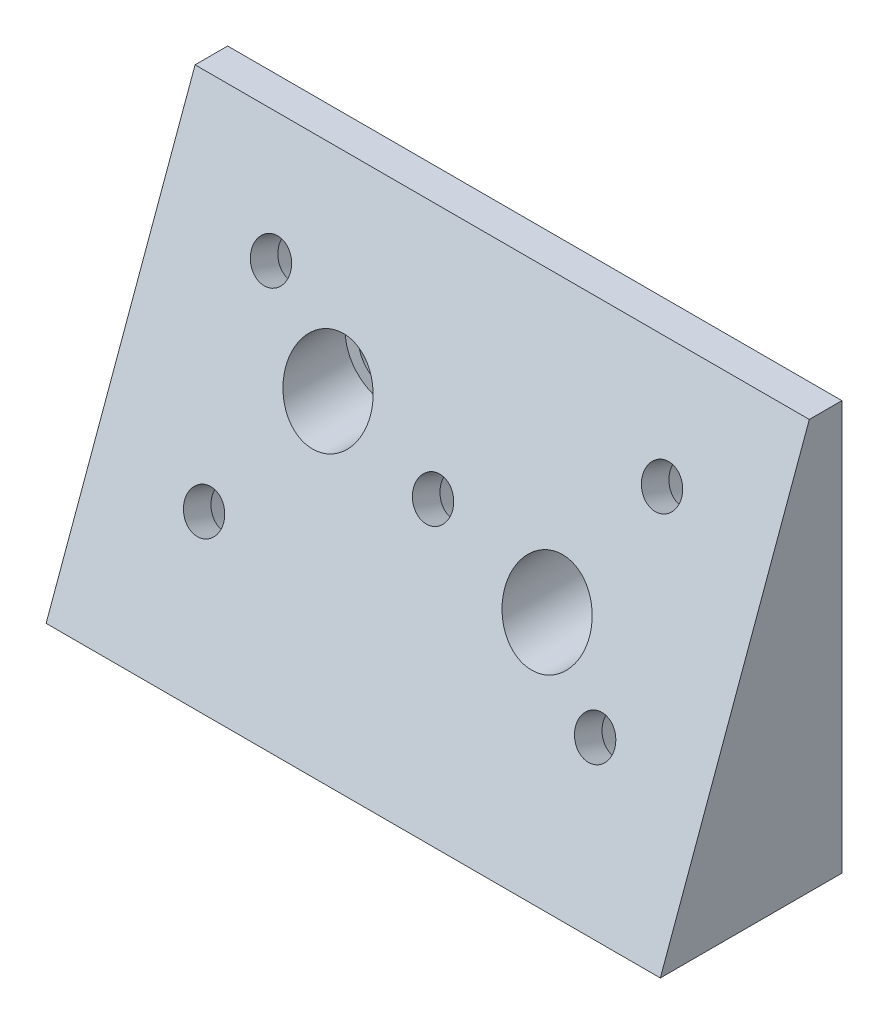
ISO-10303-21;
HEADER;
FILE_DESCRIPTION(('STEP AP214'),'2;1');
FILE_NAME('part.step','',(''),(''),'','','');
FILE_SCHEMA(('AUTOMOTIVE_DESIGN { 1 0 10303 214 1 1 1 1 }'));
ENDSEC;
DATA;
#1=APPLICATION_CONTEXT('core data for automotive mechanical design processes');
#2=APPLICATION_PROTOCOL_DEFINITION('international standard','automotive_design',2000,#1);
#3=PRODUCT_CONTEXT('',#1,'mechanical');
#4=PRODUCT('Part','Part','',(#3));
#5=PRODUCT_RELATED_PRODUCT_CATEGORY('part','',(#4));
#6=PRODUCT_DEFINITION_FORMATION('','',#4);
#7=PRODUCT_DEFINITION_CONTEXT('part definition',#1,'design');
#8=PRODUCT_DEFINITION('design','',#6,#7);
#9=PRODUCT_DEFINITION_SHAPE('','',#8);
#10=(LENGTH_UNIT() NAMED_UNIT(*) SI_UNIT(.MILLI.,.METRE.));
#11=(NAMED_UNIT(*) PLANE_ANGLE_UNIT() SI_UNIT($,.RADIAN.));
#12=(NAMED_UNIT(*) SI_UNIT($,.STERADIAN.) SOLID_ANGLE_UNIT());
#13=UNCERTAINTY_MEASURE_WITH_UNIT(LENGTH_MEASURE(1.E-05),#10,'distance_accuracy_value','');
#14=(GEOMETRIC_REPRESENTATION_CONTEXT(3) GLOBAL_UNCERTAINTY_ASSIGNED_CONTEXT((#13)) GLOBAL_UNIT_ASSIGNED_CONTEXT((#10,
#11,#12)) REPRESENTATION_CONTEXT('',''));
#15=CARTESIAN_POINT('',(0.,0.,0.));
#16=DIRECTION('',(0.,0.,1.));
#17=DIRECTION('',(1.,0.,0.));
#18=AXIS2_PLACEMENT_3D('',#15,#16,#17);
#19=CARTESIAN_POINT('',(-94.24,0.,0.));
#20=DIRECTION('',(0.,-1.,0.));
#21=DIRECTION('',(0.,0.,-1.));
#22=AXIS2_PLACEMENT_3D('',#19,#20,#21);
#23=PLANE('',#22);
#24=DIRECTION('',(0.,0.,-1.));
#25=VECTOR('',#24,1.);
#26=CARTESIAN_POINT('',(0.,0.,0.));
#27=LINE('',#26,#25);
#28=CARTESIAN_POINT('',(0.,0.,27.85359797));
#29=VERTEX_POINT('',#28);
#30=CARTESIAN_POINT('',(0.,0.,0.));
#31=VERTEX_POINT('',#30);
#32=EDGE_CURVE('E104',#29,#31,#27,.T.);
#33=ORIENTED_EDGE('',*,*,#32,.F.);
#34=DIRECTION('',(1.,0.,0.));
#35=VECTOR('',#34,1.);
#36=CARTESIAN_POINT('',(-94.24,0.,27.85359797));
#37=LINE('',#36,#35);
#38=CARTESIAN_POINT('',(-94.24,0.,27.85359797));
#39=VERTEX_POINT('',#38);
#40=EDGE_CURVE('E11',#39,#29,#37,.T.);
#41=ORIENTED_EDGE('',*,*,#40,.F.);
#42=DIRECTION('',(0.,0.,-1.));
#43=VECTOR('',#42,1.);
#44=CARTESIAN_POINT('',(-94.24,0.,0.));
#45=LINE('',#44,#43);
#46=CARTESIAN_POINT('',(-94.24,0.,0.));
#47=VERTEX_POINT('',#46);
#48=EDGE_CURVE('E97',#39,#47,#45,.T.);
#49=ORIENTED_EDGE('',*,*,#48,.T.);
#50=DIRECTION('',(1.,0.,0.));
#51=VECTOR('',#50,1.);
#52=CARTESIAN_POINT('',(-94.24,0.,0.));
#53=LINE('',#52,#51);
#54=EDGE_CURVE('E80',#47,#31,#53,.T.);
#55=ORIENTED_EDGE('',*,*,#54,.T.);
#56=EDGE_LOOP('',(#33,#41,#49,#55));
#57=FACE_BOUND('',#56,.T.);
#58=ADVANCED_FACE('F37',(#57),#23,.T.);
#59=CARTESIAN_POINT('',(-94.24,0.,27.85359797));
#60=DIRECTION('',(0.,0.342020143401997,0.939692620758127));
#61=DIRECTION('',(0.,-0.939692620758127,0.342020143401997));
#62=AXIS2_PLACEMENT_3D('',#59,#60,#61);
#63=PLANE('',#62);
#64=CARTESIAN_POINT('',(-17.20092637,47.9657014727267,10.3955103638167));
#65=DIRECTION('',(0.,0.342020143401997,0.939692620758127));
#66=DIRECTION('',(0.,-0.939692620758127,0.342020143401997));
#67=AXIS2_PLACEMENT_3D('',#64,#65,#66);
#68=CIRCLE('',#67,3.);
#69=CARTESIAN_POINT('',(-17.20092637,45.1466236104524,11.4215707940227));
#70=VERTEX_POINT('',#69);
#71=EDGE_CURVE('E162',#70,#70,#68,.T.);
#72=ORIENTED_EDGE('',*,*,#71,.F.);
#73=EDGE_LOOP('',(#72));
#74=FACE_BOUND('',#73,.T.);
#75=CARTESIAN_POINT('',(-17.20092637,19.7749228499829,20.6561146658766));
#76=DIRECTION('',(0.,0.342020143401997,0.939692620758127));
#77=DIRECTION('',(0.,-0.939692620758127,0.342020143401997));
#78=AXIS2_PLACEMENT_3D('',#75,#76,#77);
#79=CIRCLE('',#78,3.);
#80=CARTESIAN_POINT('',(-17.20092637,16.9558449877085,21.6821750960826));
#81=VERTEX_POINT('',#80);
#82=EDGE_CURVE('E158',#81,#81,#79,.T.);
#83=ORIENTED_EDGE('',*,*,#82,.F.);
#84=EDGE_LOOP('',(#83));
#85=FACE_BOUND('',#84,.T.);
#86=CARTESIAN_POINT('',(-77.20092637,47.9657014727267,10.3955103638167));
#87=DIRECTION('',(0.,0.342020143401997,0.939692620758127));
#88=DIRECTION('',(0.,-0.939692620758127,0.342020143401997));
#89=AXIS2_PLACEMENT_3D('',#86,#87,#88);
#90=CIRCLE('',#89,3.00000000000001);
#91=CARTESIAN_POINT('',(-77.20092637,45.1466236104523,11.4215707940227));
#92=VERTEX_POINT('',#91);
#93=EDGE_CURVE('E170',#92,#92,#90,.T.);
#94=ORIENTED_EDGE('',*,*,#93,.F.);
#95=EDGE_LOOP('',(#94));
#96=FACE_BOUND('',#95,.T.);
#97=CARTESIAN_POINT('',(-77.20092637,19.7749228499829,20.6561146658766));
#98=DIRECTION('',(0.,0.342020143401997,0.939692620758127));
#99=DIRECTION('',(0.,-0.939692620758127,0.342020143401997));
#100=AXIS2_PLACEMENT_3D('',#97,#98,#99);
#101=CIRCLE('',#100,3.00000000000001);
#102=CARTESIAN_POINT('',(-77.20092637,16.9558449877085,21.6821750960826));
#103=VERTEX_POINT('',#102);
#104=EDGE_CURVE('E167',#103,#103,#101,.T.);
#105=ORIENTED_EDGE('',*,*,#104,.F.);
#106=EDGE_LOOP('',(#105));
#107=FACE_BOUND('',#106,.T.);
#108=CARTESIAN_POINT('',(-47.20092637,33.8703121613548,15.5258125148467));
#109=DIRECTION('',(0.,0.342020143401997,0.939692620758127));
#110=DIRECTION('',(0.,-0.939692620758127,0.342020143401997));
#111=AXIS2_PLACEMENT_3D('',#108,#109,#110);
#112=CIRCLE('',#111,3.);
#113=CARTESIAN_POINT('',(-47.20092637,31.0512342990804,16.5518729450526));
#114=VERTEX_POINT('',#113);
#115=EDGE_CURVE('E173',#114,#114,#112,.T.);
#116=ORIENTED_EDGE('',*,*,#115,.F.);
#117=EDGE_LOOP('',(#116));
#118=FACE_BOUND('',#117,.T.);
#119=CARTESIAN_POINT('',(-28.02184799,29.25081122,17.2071733550894));
#120=DIRECTION('',(0.,0.342020143401997,0.939692620758127));
#121=DIRECTION('',(0.,0.939692620758127,-0.342020143401997));
#122=AXIS2_PLACEMENT_3D('',#119,#120,#121);
#123=ELLIPSE('',#122,6.91715552129793,6.5);
#124=CARTESIAN_POINT('',(-28.02184799,35.75081122,14.8413668317612));
#125=VERTEX_POINT('',#124);
#126=EDGE_CURVE('E125',#125,#125,#123,.T.);
#127=ORIENTED_EDGE('',*,*,#126,.F.);
#128=EDGE_LOOP('',(#127));
#129=FACE_BOUND('',#128,.T.);
#130=CARTESIAN_POINT('',(-64.99011516,38.46803544,13.8523780956041));
#131=DIRECTION('',(0.,0.342020143401997,0.939692620758127));
#132=DIRECTION('',(0.,0.939692620758127,-0.342020143401997));
#133=AXIS2_PLACEMENT_3D('',#130,#131,#132);
#134=ELLIPSE('',#133,6.91715552129793,6.5);
#135=CARTESIAN_POINT('',(-64.99011516,44.96803544,11.4865715722758));
#136=VERTEX_POINT('',#135);
#137=EDGE_CURVE('E122',#136,#136,#134,.T.);
#138=ORIENTED_EDGE('',*,*,#137,.F.);
#139=EDGE_LOOP('',(#138));
#140=FACE_BOUND('',#139,.T.);
#141=DIRECTION('',(0.,-0.939692620758127,0.342020143401997));
#142=VECTOR('',#141,1.);
#143=CARTESIAN_POINT('',(0.,0.,27.85359797));
#144=LINE('',#143,#142);
#145=CARTESIAN_POINT('',(0.,62.78974436,5.));
#146=VERTEX_POINT('',#145);
#147=EDGE_CURVE('E99',#146,#29,#144,.T.);
#148=ORIENTED_EDGE('',*,*,#147,.F.);
#149=DIRECTION('',(1.,0.,0.));
#150=VECTOR('',#149,1.);
#151=CARTESIAN_POINT('',(-94.24,62.78974436,5.));
#152=LINE('',#151,#150);
#153=CARTESIAN_POINT('',(-94.24,62.78974436,5.));
#154=VERTEX_POINT('',#153);
#155=EDGE_CURVE('E46',#154,#146,#152,.T.);
#156=ORIENTED_EDGE('',*,*,#155,.F.);
#157=DIRECTION('',(0.,-0.939692620758127,0.342020143401997));
#158=VECTOR('',#157,1.);
#159=CARTESIAN_POINT('',(-94.24,0.,27.85359797));
#160=LINE('',#159,#158);
#161=EDGE_CURVE('E94',#154,#39,#160,.T.);
#162=ORIENTED_EDGE('',*,*,#161,.T.);
#163=ORIENTED_EDGE('',*,*,#40,.T.);
#164=EDGE_LOOP('',(#148,#156,#162,#163));
#165=FACE_BOUND('',#164,.T.);
#166=ADVANCED_FACE('F195',(#74,#85,#96,#107,#118,#129,#140,#165),#63,.T.);
#167=CARTESIAN_POINT('',(-94.24,62.78974436,0.));
#168=DIRECTION('',(0.,1.,0.));
#169=DIRECTION('',(0.,0.,1.));
#170=AXIS2_PLACEMENT_3D('',#167,#168,#169);
#171=PLANE('',#170);
#172=DIRECTION('',(0.,0.,1.));
#173=VECTOR('',#172,1.);
#174=CARTESIAN_POINT('',(0.,62.78974436,0.));
#175=LINE('',#174,#173);
#176=CARTESIAN_POINT('',(0.,62.78974436,0.));
#177=VERTEX_POINT('',#176);
#178=EDGE_CURVE('E88',#177,#146,#175,.T.);
#179=ORIENTED_EDGE('',*,*,#178,.F.);
#180=DIRECTION('',(1.,0.,0.));
#181=VECTOR('',#180,1.);
#182=CARTESIAN_POINT('',(-94.24,62.78974436,0.));
#183=LINE('',#182,#181);
#184=CARTESIAN_POINT('',(-94.24,62.78974436,0.));
#185=VERTEX_POINT('',#184);
#186=EDGE_CURVE('E83',#185,#177,#183,.T.);
#187=ORIENTED_EDGE('',*,*,#186,.F.);
#188=DIRECTION('',(0.,0.,1.));
#189=VECTOR('',#188,1.);
#190=CARTESIAN_POINT('',(-94.24,62.78974436,0.));
#191=LINE('',#190,#189);
#192=EDGE_CURVE('E86',#185,#154,#191,.T.);
#193=ORIENTED_EDGE('',*,*,#192,.T.);
#194=ORIENTED_EDGE('',*,*,#155,.T.);
#195=EDGE_LOOP('',(#179,#187,#193,#194));
#196=FACE_BOUND('',#195,.T.);
#197=ADVANCED_FACE('F85',(#196),#171,.T.);
#198=CARTESIAN_POINT('',(-94.24,0.,0.));
#199=DIRECTION('',(0.,0.,-1.));
#200=DIRECTION('',(-1.,0.,0.));
#201=AXIS2_PLACEMENT_3D('',#198,#199,#200);
#202=PLANE('',#201);
#203=CARTESIAN_POINT('',(-17.20092637,12.2567119541142,0.));
#204=DIRECTION('',(0.,0.,-1.));
#205=DIRECTION('',(0.,1.,0.));
#206=AXIS2_PLACEMENT_3D('',#203,#204,#205);
#207=ELLIPSE('',#206,5.05484441941003,4.75);
#208=CARTESIAN_POINT('',(-17.20092637,17.3115563735242,0.));
#209=VERTEX_POINT('',#208);
#210=EDGE_CURVE('E40',#209,#209,#207,.T.);
#211=ORIENTED_EDGE('',*,*,#210,.F.);
#212=EDGE_LOOP('',(#211));
#213=FACE_BOUND('',#212,.T.);
#214=CARTESIAN_POINT('',(-17.20092637,44.1820451293354,0.));
#215=DIRECTION('',(0.,0.,-1.));
#216=DIRECTION('',(0.,1.,0.));
#217=AXIS2_PLACEMENT_3D('',#214,#215,#216);
#218=ELLIPSE('',#217,5.05484441941003,4.75);
#219=CARTESIAN_POINT('',(-17.20092637,49.2368895487454,0.));
#220=VERTEX_POINT('',#219);
#221=EDGE_CURVE('E153',#220,#220,#218,.T.);
#222=ORIENTED_EDGE('',*,*,#221,.F.);
#223=EDGE_LOOP('',(#222));
#224=FACE_BOUND('',#223,.T.);
#225=CARTESIAN_POINT('',(-47.20092637,28.2193785417248,0.));
#226=DIRECTION('',(0.,0.,-1.));
#227=DIRECTION('',(0.,1.,0.));
#228=AXIS2_PLACEMENT_3D('',#225,#226,#227);
#229=ELLIPSE('',#228,5.05484441941002,4.75);
#230=CARTESIAN_POINT('',(-47.20092637,33.2742229611348,0.));
#231=VERTEX_POINT('',#230);
#232=EDGE_CURVE('E151',#231,#231,#229,.T.);
#233=ORIENTED_EDGE('',*,*,#232,.F.);
#234=EDGE_LOOP('',(#233));
#235=FACE_BOUND('',#234,.T.);
#236=CARTESIAN_POINT('',(-77.20092637,44.1820451293354,0.));
#237=DIRECTION('',(0.,0.,-1.));
#238=DIRECTION('',(0.,1.,0.));
#239=AXIS2_PLACEMENT_3D('',#236,#237,#238);
#240=ELLIPSE('',#239,5.05484441941003,4.75);
#241=CARTESIAN_POINT('',(-77.20092637,49.2368895487454,0.));
#242=VERTEX_POINT('',#241);
#243=EDGE_CURVE('E148',#242,#242,#240,.T.);
#244=ORIENTED_EDGE('',*,*,#243,.F.);
#245=EDGE_LOOP('',(#244));
#246=FACE_BOUND('',#245,.T.);
#247=CARTESIAN_POINT('',(-77.20092637,12.2567119541142,0.));
#248=DIRECTION('',(0.,0.,-1.));
#249=DIRECTION('',(0.,1.,0.));
#250=AXIS2_PLACEMENT_3D('',#247,#248,#249);
#251=ELLIPSE('',#250,5.05484441941003,4.75);
#252=CARTESIAN_POINT('',(-77.20092637,17.3115563735242,0.));
#253=VERTEX_POINT('',#252);
#254=EDGE_CURVE('E145',#253,#253,#251,.T.);
#255=ORIENTED_EDGE('',*,*,#254,.F.);
#256=EDGE_LOOP('',(#255));
#257=FACE_BOUND('',#256,.T.);
#258=CARTESIAN_POINT('',(-28.02184799,29.25081122,0.));
#259=DIRECTION('',(0.,0.,-1.));
#260=DIRECTION('',(-1.,0.,0.));
#261=AXIS2_PLACEMENT_3D('',#258,#259,#260);
#262=CIRCLE('',#261,4.5);
#263=CARTESIAN_POINT('',(-32.52184799,29.25081122,0.));
#264=VERTEX_POINT('',#263);
#265=EDGE_CURVE('E108',#264,#264,#262,.T.);
#266=ORIENTED_EDGE('',*,*,#265,.F.);
#267=EDGE_LOOP('',(#266));
#268=FACE_BOUND('',#267,.T.);
#269=CARTESIAN_POINT('',(-64.99011516,38.46803544,0.));
#270=DIRECTION('',(0.,0.,-1.));
#271=DIRECTION('',(-1.,0.,0.));
#272=AXIS2_PLACEMENT_3D('',#269,#270,#271);
#273=CIRCLE('',#272,4.50000000000001);
#274=CARTESIAN_POINT('',(-69.49011516,38.46803544,0.));
#275=VERTEX_POINT('',#274);
#276=EDGE_CURVE('E128',#275,#275,#273,.T.);
#277=ORIENTED_EDGE('',*,*,#276,.F.);
#278=EDGE_LOOP('',(#277));
#279=FACE_BOUND('',#278,.T.);
#280=DIRECTION('',(0.,1.,0.));
#281=VECTOR('',#280,1.);
#282=CARTESIAN_POINT('',(0.,0.,0.));
#283=LINE('',#282,#281);
#284=EDGE_CURVE('E107',#31,#177,#283,.T.);
#285=ORIENTED_EDGE('',*,*,#284,.F.);
#286=ORIENTED_EDGE('',*,*,#54,.F.);
#287=DIRECTION('',(0.,1.,0.));
#288=VECTOR('',#287,1.);
#289=CARTESIAN_POINT('',(-94.24,0.,0.));
#290=LINE('',#289,#288);
#291=EDGE_CURVE('E93',#47,#185,#290,.T.);
#292=ORIENTED_EDGE('',*,*,#291,.T.);
#293=ORIENTED_EDGE('',*,*,#186,.T.);
#294=EDGE_LOOP('',(#285,#286,#292,#293));
#295=FACE_BOUND('',#294,.T.);
#296=ADVANCED_FACE('F96',(#213,#224,#235,#246,#257,#268,#279,#295),#202,.T.);
#297=CARTESIAN_POINT('',(-94.24,0.,0.));
#298=DIRECTION('',(-1.,0.,0.));
#299=DIRECTION('',(0.,0.,1.));
#300=AXIS2_PLACEMENT_3D('',#297,#298,#299);
#301=PLANE('',#300);
#302=ORIENTED_EDGE('',*,*,#48,.F.);
#303=ORIENTED_EDGE('',*,*,#161,.F.);
#304=ORIENTED_EDGE('',*,*,#192,.F.);
#305=ORIENTED_EDGE('',*,*,#291,.F.);
#306=EDGE_LOOP('',(#302,#303,#304,#305));
#307=FACE_BOUND('',#306,.T.);
#308=ADVANCED_FACE('F92',(#307),#301,.T.);
#309=CARTESIAN_POINT('',(0.,0.,0.));
#310=DIRECTION('',(-1.,0.,0.));
#311=DIRECTION('',(0.,0.,1.));
#312=AXIS2_PLACEMENT_3D('',#309,#310,#311);
#313=PLANE('',#312);
#314=ORIENTED_EDGE('',*,*,#32,.T.);
#315=ORIENTED_EDGE('',*,*,#284,.T.);
#316=ORIENTED_EDGE('',*,*,#178,.T.);
#317=ORIENTED_EDGE('',*,*,#147,.T.);
#318=EDGE_LOOP('',(#314,#315,#316,#317));
#319=FACE_BOUND('',#318,.T.);
#320=ADVANCED_FACE('F193',(#319),#313,.F.);
#321=CARTESIAN_POINT('',(-64.99011516,38.46803544,94.24));
#322=DIRECTION('',(0.,0.,-1.));
#323=DIRECTION('',(-1.,0.,0.));
#324=AXIS2_PLACEMENT_3D('',#321,#322,#323);
#325=CYLINDRICAL_SURFACE('',#324,4.50000000000001);
#326=CARTESIAN_POINT('',(-64.99011516,38.46803544,4.69));
#327=DIRECTION('',(0.,0.,-1.));
#328=DIRECTION('',(-1.,0.,0.));
#329=AXIS2_PLACEMENT_3D('',#326,#327,#328);
#330=CIRCLE('',#329,4.50000000000001);
#331=CARTESIAN_POINT('',(-69.49011516,38.46803544,4.69));
#332=VERTEX_POINT('',#331);
#333=EDGE_CURVE('E118',#332,#332,#330,.F.);
#334=ORIENTED_EDGE('',*,*,#333,.T.);
#335=EDGE_LOOP('',(#334));
#336=FACE_BOUND('',#335,.T.);
#337=ORIENTED_EDGE('',*,*,#276,.T.);
#338=EDGE_LOOP('',(#337));
#339=FACE_BOUND('',#338,.T.);
#340=ADVANCED_FACE('F185',(#336,#339),#325,.F.);
#341=CARTESIAN_POINT('',(-28.02184799,29.25081122,94.24));
#342=DIRECTION('',(0.,0.,-1.));
#343=DIRECTION('',(-1.,0.,0.));
#344=AXIS2_PLACEMENT_3D('',#341,#342,#343);
#345=CYLINDRICAL_SURFACE('',#344,4.5);
#346=CARTESIAN_POINT('',(-28.02184799,29.25081122,4.69));
#347=DIRECTION('',(0.,0.,-1.));
#348=DIRECTION('',(-1.,0.,0.));
#349=AXIS2_PLACEMENT_3D('',#346,#347,#348);
#350=CIRCLE('',#349,4.5);
#351=CARTESIAN_POINT('',(-32.52184799,29.25081122,4.69));
#352=VERTEX_POINT('',#351);
#353=EDGE_CURVE('E115',#352,#352,#350,.F.);
#354=ORIENTED_EDGE('',*,*,#353,.T.);
#355=EDGE_LOOP('',(#354));
#356=FACE_BOUND('',#355,.T.);
#357=ORIENTED_EDGE('',*,*,#265,.T.);
#358=EDGE_LOOP('',(#357));
#359=FACE_BOUND('',#358,.T.);
#360=ADVANCED_FACE('F210',(#356,#359),#345,.F.);
#361=CARTESIAN_POINT('',(-28.02184799,29.25081122,4.69));
#362=DIRECTION('',(0.,0.,-1.));
#363=DIRECTION('',(-1.,0.,0.));
#364=AXIS2_PLACEMENT_3D('',#361,#362,#363);
#365=PLANE('',#364);
#366=CARTESIAN_POINT('',(-28.02184799,29.25081122,4.69));
#367=DIRECTION('',(0.,0.,-1.));
#368=DIRECTION('',(-1.,0.,0.));
#369=AXIS2_PLACEMENT_3D('',#366,#367,#368);
#370=CIRCLE('',#369,6.5);
#371=CARTESIAN_POINT('',(-34.52184799,29.25081122,4.69));
#372=VERTEX_POINT('',#371);
#373=EDGE_CURVE('E119',#372,#372,#370,.T.);
#374=ORIENTED_EDGE('',*,*,#373,.F.);
#375=EDGE_LOOP('',(#374));
#376=FACE_BOUND('',#375,.T.);
#377=ORIENTED_EDGE('',*,*,#353,.F.);
#378=EDGE_LOOP('',(#377));
#379=FACE_BOUND('',#378,.T.);
#380=ADVANCED_FACE('F216',(#376,#379),#365,.F.);
#381=CARTESIAN_POINT('',(-28.02184799,29.25081122,98.93));
#382=DIRECTION('',(0.,0.,-1.));
#383=DIRECTION('',(-1.,0.,0.));
#384=AXIS2_PLACEMENT_3D('',#381,#382,#383);
#385=CYLINDRICAL_SURFACE('',#384,6.5);
#386=ORIENTED_EDGE('',*,*,#126,.T.);
#387=EDGE_LOOP('',(#386));
#388=FACE_BOUND('',#387,.T.);
#389=ORIENTED_EDGE('',*,*,#373,.T.);
#390=EDGE_LOOP('',(#389));
#391=FACE_BOUND('',#390,.T.);
#392=ADVANCED_FACE('F222',(#388,#391),#385,.F.);
#393=CARTESIAN_POINT('',(-64.99011516,38.46803544,4.69));
#394=DIRECTION('',(0.,0.,-1.));
#395=DIRECTION('',(-1.,0.,0.));
#396=AXIS2_PLACEMENT_3D('',#393,#394,#395);
#397=PLANE('',#396);
#398=CARTESIAN_POINT('',(-64.99011516,38.46803544,4.69));
#399=DIRECTION('',(0.,0.,-1.));
#400=DIRECTION('',(-1.,0.,0.));
#401=AXIS2_PLACEMENT_3D('',#398,#399,#400);
#402=CIRCLE('',#401,6.5);
#403=CARTESIAN_POINT('',(-71.49011516,38.46803544,4.69));
#404=VERTEX_POINT('',#403);
#405=EDGE_CURVE('E176',#404,#404,#402,.T.);
#406=ORIENTED_EDGE('',*,*,#405,.F.);
#407=EDGE_LOOP('',(#406));
#408=FACE_BOUND('',#407,.T.);
#409=ORIENTED_EDGE('',*,*,#333,.F.);
#410=EDGE_LOOP('',(#409));
#411=FACE_BOUND('',#410,.T.);
#412=ADVANCED_FACE('F218',(#408,#411),#397,.F.);
#413=CARTESIAN_POINT('',(-64.99011516,38.46803544,98.93));
#414=DIRECTION('',(0.,0.,-1.));
#415=DIRECTION('',(-1.,0.,0.));
#416=AXIS2_PLACEMENT_3D('',#413,#414,#415);
#417=CYLINDRICAL_SURFACE('',#416,6.5);
#418=ORIENTED_EDGE('',*,*,#137,.T.);
#419=EDGE_LOOP('',(#418));
#420=FACE_BOUND('',#419,.T.);
#421=ORIENTED_EDGE('',*,*,#405,.T.);
#422=EDGE_LOOP('',(#421));
#423=FACE_BOUND('',#422,.T.);
#424=ADVANCED_FACE('F221',(#420,#423),#417,.F.);
#425=CARTESIAN_POINT('',(-47.20092637,1.63833384715066,-73.0308200653993));
#426=DIRECTION('',(0.,0.342020143401997,0.939692620758127));
#427=DIRECTION('',(0.,-0.939692620758127,0.342020143401997));
#428=AXIS2_PLACEMENT_3D('',#425,#426,#427);
#429=CYLINDRICAL_SURFACE('',#428,3.);
#430=CARTESIAN_POINT('',(-47.20092637,32.3312215160459,11.2971957214351));
#431=DIRECTION('',(0.,0.342020143401997,0.939692620758127));
#432=DIRECTION('',(0.,-0.939692620758127,0.342020143401997));
#433=AXIS2_PLACEMENT_3D('',#430,#431,#432);
#434=CIRCLE('',#433,3.);
#435=CARTESIAN_POINT('',(-47.20092637,29.5121436537715,12.3232561516411));
#436=VERTEX_POINT('',#435);
#437=EDGE_CURVE('E142',#436,#436,#434,.F.);
#438=ORIENTED_EDGE('',*,*,#437,.T.);
#439=EDGE_LOOP('',(#438));
#440=FACE_BOUND('',#439,.T.);
#441=ORIENTED_EDGE('',*,*,#115,.T.);
#442=EDGE_LOOP('',(#441));
#443=FACE_BOUND('',#442,.T.);
#444=ADVANCED_FACE('F226',(#440,#443),#429,.F.);
#445=CARTESIAN_POINT('',(-77.20092637,-12.4570554642212,-67.9005179143693));
#446=DIRECTION('',(0.,0.342020143401997,0.939692620758127));
#447=DIRECTION('',(0.,-0.939692620758127,0.342020143401997));
#448=AXIS2_PLACEMENT_3D('',#445,#446,#447);
#449=CYLINDRICAL_SURFACE('',#448,3.00000000000001);
#450=CARTESIAN_POINT('',(-77.20092637,18.2358322046739,16.427497872465));
#451=DIRECTION('',(0.,0.342020143401997,0.939692620758127));
#452=DIRECTION('',(0.,-0.939692620758127,0.342020143401997));
#453=AXIS2_PLACEMENT_3D('',#450,#451,#452);
#454=CIRCLE('',#453,3.00000000000001);
#455=CARTESIAN_POINT('',(-77.20092637,15.4167543423996,17.453558302671));
#456=VERTEX_POINT('',#455);
#457=EDGE_CURVE('E139',#456,#456,#454,.F.);
#458=ORIENTED_EDGE('',*,*,#457,.T.);
#459=EDGE_LOOP('',(#458));
#460=FACE_BOUND('',#459,.T.);
#461=ORIENTED_EDGE('',*,*,#104,.T.);
#462=EDGE_LOOP('',(#461));
#463=FACE_BOUND('',#462,.T.);
#464=ADVANCED_FACE('F236',(#460,#463),#449,.F.);
#465=CARTESIAN_POINT('',(-77.20092637,15.7337231585226,-78.1611222164292));
#466=DIRECTION('',(0.,0.342020143401997,0.939692620758127));
#467=DIRECTION('',(0.,-0.939692620758127,0.342020143401997));
#468=AXIS2_PLACEMENT_3D('',#465,#466,#467);
#469=CYLINDRICAL_SURFACE('',#468,3.00000000000001);
#470=CARTESIAN_POINT('',(-77.20092637,46.4266108274178,6.16689357040513));
#471=DIRECTION('',(0.,0.342020143401997,0.939692620758127));
#472=DIRECTION('',(0.,-0.939692620758127,0.342020143401997));
#473=AXIS2_PLACEMENT_3D('',#470,#471,#472);
#474=CIRCLE('',#473,3.00000000000001);
#475=CARTESIAN_POINT('',(-77.20092637,43.6075329651434,7.19295400061113));
#476=VERTEX_POINT('',#475);
#477=EDGE_CURVE('E136',#476,#476,#474,.F.);
#478=ORIENTED_EDGE('',*,*,#477,.T.);
#479=EDGE_LOOP('',(#478));
#480=FACE_BOUND('',#479,.T.);
#481=ORIENTED_EDGE('',*,*,#93,.T.);
#482=EDGE_LOOP('',(#481));
#483=FACE_BOUND('',#482,.T.);
#484=ADVANCED_FACE('F246',(#480,#483),#469,.F.);
#485=CARTESIAN_POINT('',(-17.20092637,-12.4570554642212,-67.9005179143693));
#486=DIRECTION('',(0.,0.342020143401997,0.939692620758127));
#487=DIRECTION('',(0.,-0.939692620758127,0.342020143401997));
#488=AXIS2_PLACEMENT_3D('',#485,#486,#487);
#489=CYLINDRICAL_SURFACE('',#488,3.);
#490=CARTESIAN_POINT('',(-17.20092637,18.2358322046739,16.427497872465));
#491=DIRECTION('',(0.,0.342020143401997,0.939692620758127));
#492=DIRECTION('',(0.,-0.939692620758127,0.342020143401997));
#493=AXIS2_PLACEMENT_3D('',#490,#491,#492);
#494=CIRCLE('',#493,3.);
#495=CARTESIAN_POINT('',(-17.20092637,15.4167543423996,17.453558302671));
#496=VERTEX_POINT('',#495);
#497=EDGE_CURVE('E132',#496,#496,#494,.F.);
#498=ORIENTED_EDGE('',*,*,#497,.T.);
#499=EDGE_LOOP('',(#498));
#500=FACE_BOUND('',#499,.T.);
#501=ORIENTED_EDGE('',*,*,#82,.T.);
#502=EDGE_LOOP('',(#501));
#503=FACE_BOUND('',#502,.T.);
#504=ADVANCED_FACE('F242',(#500,#503),#489,.F.);
#505=CARTESIAN_POINT('',(-17.20092637,15.7337231585226,-78.1611222164292));
#506=DIRECTION('',(0.,0.342020143401997,0.939692620758127));
#507=DIRECTION('',(0.,-0.939692620758127,0.342020143401997));
#508=AXIS2_PLACEMENT_3D('',#505,#506,#507);
#509=CYLINDRICAL_SURFACE('',#508,3.);
#510=CARTESIAN_POINT('',(-17.20092637,46.4266108274178,6.16689357040513));
#511=DIRECTION('',(0.,0.342020143401997,0.939692620758127));
#512=DIRECTION('',(0.,-0.939692620758127,0.342020143401997));
#513=AXIS2_PLACEMENT_3D('',#510,#511,#512);
#514=CIRCLE('',#513,3.);
#515=CARTESIAN_POINT('',(-17.20092637,43.6075329651434,7.19295400061112));
#516=VERTEX_POINT('',#515);
#517=EDGE_CURVE('E129',#516,#516,#514,.F.);
#518=ORIENTED_EDGE('',*,*,#517,.T.);
#519=EDGE_LOOP('',(#518));
#520=FACE_BOUND('',#519,.T.);
#521=ORIENTED_EDGE('',*,*,#71,.T.);
#522=EDGE_LOOP('',(#521));
#523=FACE_BOUND('',#522,.T.);
#524=ADVANCED_FACE('F238',(#520,#523),#509,.F.);
#525=CARTESIAN_POINT('',(-17.20092637,46.4266108274178,6.16689357040513));
#526=DIRECTION('',(0.,0.342020143401997,0.939692620758127));
#527=DIRECTION('',(0.,-0.939692620758127,0.342020143401997));
#528=AXIS2_PLACEMENT_3D('',#525,#526,#527);
#529=PLANE('',#528);
#530=CARTESIAN_POINT('',(-17.20092637,46.4266108274178,6.16689357040513));
#531=DIRECTION('',(0.,0.342020143401997,0.939692620758127));
#532=DIRECTION('',(0.,-0.939692620758127,0.342020143401997));
#533=AXIS2_PLACEMENT_3D('',#530,#531,#532);
#534=CIRCLE('',#533,4.75);
#535=CARTESIAN_POINT('',(-17.20092637,41.9630708788166,7.79148925156462));
#536=VERTEX_POINT('',#535);
#537=EDGE_CURVE('E305',#536,#536,#534,.T.);
#538=ORIENTED_EDGE('',*,*,#537,.F.);
#539=EDGE_LOOP('',(#538));
#540=FACE_BOUND('',#539,.T.);
#541=ORIENTED_EDGE('',*,*,#517,.F.);
#542=EDGE_LOOP('',(#541));
#543=FACE_BOUND('',#542,.T.);
#544=ADVANCED_FACE('F241',(#540,#543),#529,.F.);
#545=CARTESIAN_POINT('',(-17.20092637,14.1946325132136,-82.3897390098408));
#546=DIRECTION('',(0.,0.342020143401997,0.939692620758127));
#547=DIRECTION('',(0.,-0.939692620758127,0.342020143401997));
#548=AXIS2_PLACEMENT_3D('',#545,#546,#547);
#549=CYLINDRICAL_SURFACE('',#548,4.75);
#550=ORIENTED_EDGE('',*,*,#221,.T.);
#551=EDGE_LOOP('',(#550));
#552=FACE_BOUND('',#551,.T.);
#553=ORIENTED_EDGE('',*,*,#537,.T.);
#554=EDGE_LOOP('',(#553));
#555=FACE_BOUND('',#554,.T.);
#556=ADVANCED_FACE('F268',(#552,#555),#549,.F.);
#557=CARTESIAN_POINT('',(-17.20092637,18.2358322046739,16.427497872465));
#558=DIRECTION('',(0.,0.342020143401997,0.939692620758127));
#559=DIRECTION('',(0.,-0.939692620758127,0.342020143401997));
#560=AXIS2_PLACEMENT_3D('',#557,#558,#559);
#561=PLANE('',#560);
#562=CARTESIAN_POINT('',(-17.20092637,18.2358322046739,16.427497872465));
#563=DIRECTION('',(0.,0.342020143401997,0.939692620758127));
#564=DIRECTION('',(0.,-0.939692620758127,0.342020143401997));
#565=AXIS2_PLACEMENT_3D('',#562,#563,#564);
#566=CIRCLE('',#565,4.75);
#567=CARTESIAN_POINT('',(-17.20092637,13.7722922560728,18.0520935536245));
#568=VERTEX_POINT('',#567);
#569=EDGE_CURVE('E302',#568,#568,#566,.T.);
#570=ORIENTED_EDGE('',*,*,#569,.F.);
#571=EDGE_LOOP('',(#570));
#572=FACE_BOUND('',#571,.T.);
#573=ORIENTED_EDGE('',*,*,#497,.F.);
#574=EDGE_LOOP('',(#573));
#575=FACE_BOUND('',#574,.T.);
#576=ADVANCED_FACE('F264',(#572,#575),#561,.F.);
#577=CARTESIAN_POINT('',(-17.20092637,-13.9961461095302,-72.1291347077809));
#578=DIRECTION('',(0.,0.342020143401997,0.939692620758127));
#579=DIRECTION('',(0.,-0.939692620758127,0.342020143401997));
#580=AXIS2_PLACEMENT_3D('',#577,#578,#579);
#581=CYLINDRICAL_SURFACE('',#580,4.75);
#582=ORIENTED_EDGE('',*,*,#210,.T.);
#583=EDGE_LOOP('',(#582));
#584=FACE_BOUND('',#583,.T.);
#585=ORIENTED_EDGE('',*,*,#569,.T.);
#586=EDGE_LOOP('',(#585));
#587=FACE_BOUND('',#586,.T.);
#588=ADVANCED_FACE('F267',(#584,#587),#581,.F.);
#589=CARTESIAN_POINT('',(-77.20092637,46.4266108274177,6.16689357040514));
#590=DIRECTION('',(0.,0.342020143401997,0.939692620758127));
#591=DIRECTION('',(0.,-0.939692620758127,0.342020143401997));
#592=AXIS2_PLACEMENT_3D('',#589,#590,#591);
#593=PLANE('',#592);
#594=CARTESIAN_POINT('',(-77.20092637,46.4266108274177,6.16689357040514));
#595=DIRECTION('',(0.,0.342020143401997,0.939692620758127));
#596=DIRECTION('',(0.,-0.939692620758127,0.342020143401997));
#597=AXIS2_PLACEMENT_3D('',#594,#595,#596);
#598=CIRCLE('',#597,4.75);
#599=CARTESIAN_POINT('',(-77.20092637,41.9630708788166,7.79148925156462));
#600=VERTEX_POINT('',#599);
#601=EDGE_CURVE('E296',#600,#600,#598,.T.);
#602=ORIENTED_EDGE('',*,*,#601,.F.);
#603=EDGE_LOOP('',(#602));
#604=FACE_BOUND('',#603,.T.);
#605=ORIENTED_EDGE('',*,*,#477,.F.);
#606=EDGE_LOOP('',(#605));
#607=FACE_BOUND('',#606,.T.);
#608=ADVANCED_FACE('F272',(#604,#607),#593,.F.);
#609=CARTESIAN_POINT('',(-77.20092637,14.1946325132136,-82.3897390098408));
#610=DIRECTION('',(0.,0.342020143401997,0.939692620758127));
#611=DIRECTION('',(0.,-0.939692620758127,0.342020143401997));
#612=AXIS2_PLACEMENT_3D('',#609,#610,#611);
#613=CYLINDRICAL_SURFACE('',#612,4.75);
#614=ORIENTED_EDGE('',*,*,#243,.T.);
#615=EDGE_LOOP('',(#614));
#616=FACE_BOUND('',#615,.T.);
#617=ORIENTED_EDGE('',*,*,#601,.T.);
#618=EDGE_LOOP('',(#617));
#619=FACE_BOUND('',#618,.T.);
#620=ADVANCED_FACE('F262',(#616,#619),#613,.F.);
#621=CARTESIAN_POINT('',(-77.20092637,18.2358322046739,16.427497872465));
#622=DIRECTION('',(0.,0.342020143401997,0.939692620758127));
#623=DIRECTION('',(0.,-0.939692620758127,0.342020143401997));
#624=AXIS2_PLACEMENT_3D('',#621,#622,#623);
#625=PLANE('',#624);
#626=CARTESIAN_POINT('',(-77.20092637,18.2358322046739,16.427497872465));
#627=DIRECTION('',(0.,0.342020143401997,0.939692620758127));
#628=DIRECTION('',(0.,-0.939692620758127,0.342020143401997));
#629=AXIS2_PLACEMENT_3D('',#626,#627,#628);
#630=CIRCLE('',#629,4.75);
#631=CARTESIAN_POINT('',(-77.20092637,13.7722922560728,18.0520935536245));
#632=VERTEX_POINT('',#631);
#633=EDGE_CURVE('E133',#632,#632,#630,.T.);
#634=ORIENTED_EDGE('',*,*,#633,.F.);
#635=EDGE_LOOP('',(#634));
#636=FACE_BOUND('',#635,.T.);
#637=ORIENTED_EDGE('',*,*,#457,.F.);
#638=EDGE_LOOP('',(#637));
#639=FACE_BOUND('',#638,.T.);
#640=ADVANCED_FACE('F258',(#636,#639),#625,.F.);
#641=CARTESIAN_POINT('',(-77.20092637,-13.9961461095302,-72.1291347077809));
#642=DIRECTION('',(0.,0.342020143401997,0.939692620758127));
#643=DIRECTION('',(0.,-0.939692620758127,0.342020143401997));
#644=AXIS2_PLACEMENT_3D('',#641,#642,#643);
#645=CYLINDRICAL_SURFACE('',#644,4.75);
#646=ORIENTED_EDGE('',*,*,#254,.T.);
#647=EDGE_LOOP('',(#646));
#648=FACE_BOUND('',#647,.T.);
#649=ORIENTED_EDGE('',*,*,#633,.T.);
#650=EDGE_LOOP('',(#649));
#651=FACE_BOUND('',#650,.T.);
#652=ADVANCED_FACE('F254',(#648,#651),#645,.F.);
#653=CARTESIAN_POINT('',(-47.20092637,32.3312215160458,11.2971957214351));
#654=DIRECTION('',(0.,0.342020143401997,0.939692620758127));
#655=DIRECTION('',(0.,-0.939692620758127,0.342020143401997));
#656=AXIS2_PLACEMENT_3D('',#653,#654,#655);
#657=PLANE('',#656);
#658=CARTESIAN_POINT('',(-47.20092637,32.3312215160458,11.2971957214351));
#659=DIRECTION('',(0.,0.342020143401997,0.939692620758127));
#660=DIRECTION('',(0.,-0.939692620758127,0.342020143401997));
#661=AXIS2_PLACEMENT_3D('',#658,#659,#660);
#662=CIRCLE('',#661,4.75);
#663=CARTESIAN_POINT('',(-47.20092637,27.8676815674447,12.9217914025946));
#664=VERTEX_POINT('',#663);
#665=EDGE_CURVE('E297',#664,#664,#662,.T.);
#666=ORIENTED_EDGE('',*,*,#665,.F.);
#667=EDGE_LOOP('',(#666));
#668=FACE_BOUND('',#667,.T.);
#669=ORIENTED_EDGE('',*,*,#437,.F.);
#670=EDGE_LOOP('',(#669));
#671=FACE_BOUND('',#670,.T.);
#672=ADVANCED_FACE('F257',(#668,#671),#657,.F.);
#673=CARTESIAN_POINT('',(-47.20092637,0.0992432018416742,-77.2594368588108));
#674=DIRECTION('',(0.,0.342020143401997,0.939692620758127));
#675=DIRECTION('',(0.,-0.939692620758127,0.342020143401997));
#676=AXIS2_PLACEMENT_3D('',#673,#674,#675);
#677=CYLINDRICAL_SURFACE('',#676,4.75);
#678=ORIENTED_EDGE('',*,*,#232,.T.);
#679=EDGE_LOOP('',(#678));
#680=FACE_BOUND('',#679,.T.);
#681=ORIENTED_EDGE('',*,*,#665,.T.);
#682=EDGE_LOOP('',(#681));
#683=FACE_BOUND('',#682,.T.);
#684=ADVANCED_FACE('F280',(#680,#683),#677,.F.);
#685=CLOSED_SHELL('',(#58,#166,#197,#296,#308,#320,#340,#360,#380,#392,#412,#424,#444,#464,#484,
#504,#524,#544,#556,#576,#588,#608,#620,#640,#652,#672,#684));
#686=MANIFOLD_SOLID_BREP('B2',#685);
#687=ADVANCED_BREP_SHAPE_REPRESENTATION('',(#18,#686),#14);
#688=SHAPE_DEFINITION_REPRESENTATION(#9,#687);
ENDSEC;
END-ISO-10303-21;
